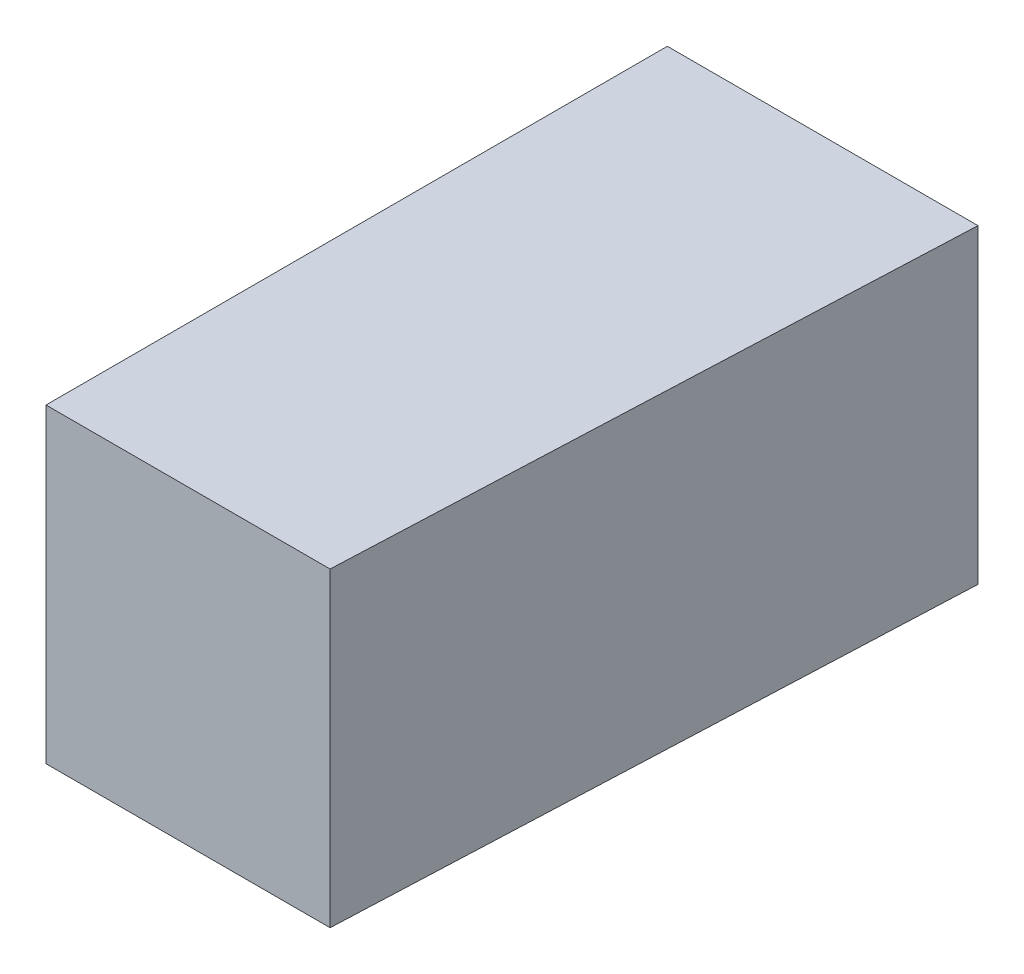
ISO-10303-21;
HEADER;
FILE_DESCRIPTION(('STEP AP214'),'2;1');
FILE_NAME('part.step','',(''),(''),'','','');
FILE_SCHEMA(('AUTOMOTIVE_DESIGN { 1 0 10303 214 1 1 1 1 }'));
ENDSEC;
DATA;
#1=APPLICATION_CONTEXT('core data for automotive mechanical design processes');
#2=APPLICATION_PROTOCOL_DEFINITION('international standard','automotive_design',2000,#1);
#3=PRODUCT_CONTEXT('',#1,'mechanical');
#4=PRODUCT('Part','Part','',(#3));
#5=PRODUCT_RELATED_PRODUCT_CATEGORY('part','',(#4));
#6=PRODUCT_DEFINITION_FORMATION('','',#4);
#7=PRODUCT_DEFINITION_CONTEXT('part definition',#1,'design');
#8=PRODUCT_DEFINITION('design','',#6,#7);
#9=PRODUCT_DEFINITION_SHAPE('','',#8);
#10=(LENGTH_UNIT() NAMED_UNIT(*) SI_UNIT(.MILLI.,.METRE.));
#11=(NAMED_UNIT(*) PLANE_ANGLE_UNIT() SI_UNIT($,.RADIAN.));
#12=(NAMED_UNIT(*) SI_UNIT($,.STERADIAN.) SOLID_ANGLE_UNIT());
#13=UNCERTAINTY_MEASURE_WITH_UNIT(LENGTH_MEASURE(1.E-05),#10,'distance_accuracy_value','');
#14=(GEOMETRIC_REPRESENTATION_CONTEXT(3) GLOBAL_UNCERTAINTY_ASSIGNED_CONTEXT((#13)) GLOBAL_UNIT_ASSIGNED_CONTEXT((#10,
#11,#12)) REPRESENTATION_CONTEXT('',''));
#15=CARTESIAN_POINT('',(0.,0.,0.));
#16=DIRECTION('',(0.,0.,1.));
#17=DIRECTION('',(1.,0.,0.));
#18=AXIS2_PLACEMENT_3D('',#15,#16,#17);
#19=CARTESIAN_POINT('',(0.,10.,0.));
#20=DIRECTION('',(1.,0.,0.));
#21=DIRECTION('',(0.,0.,-1.));
#22=AXIS2_PLACEMENT_3D('',#19,#20,#21);
#23=PLANE('',#22);
#24=DIRECTION('',(0.,0.,-1.));
#25=VECTOR('',#24,1.);
#26=CARTESIAN_POINT('',(0.,8.,-13.385));
#27=LINE('',#26,#25);
#28=CARTESIAN_POINT('',(0.,8.,-6.615));
#29=VERTEX_POINT('',#28);
#30=CARTESIAN_POINT('',(0.,8.,-13.385));
#31=VERTEX_POINT('',#30);
#32=EDGE_CURVE('E235',#29,#31,#27,.T.);
#33=ORIENTED_EDGE('',*,*,#32,.F.);
#34=DIRECTION('',(0.,-1.,0.));
#35=VECTOR('',#34,1.);
#36=CARTESIAN_POINT('',(0.,8.,-6.615));
#37=LINE('',#36,#35);
#38=CARTESIAN_POINT('',(0.,0.,-6.615));
#39=VERTEX_POINT('',#38);
#40=EDGE_CURVE('E179',#29,#39,#37,.T.);
#41=ORIENTED_EDGE('',*,*,#40,.T.);
#42=DIRECTION('',(0.,0.,1.));
#43=VECTOR('',#42,1.);
#44=CARTESIAN_POINT('',(0.,0.,0.));
#45=LINE('',#44,#43);
#46=CARTESIAN_POINT('',(0.,0.,0.));
#47=VERTEX_POINT('',#46);
#48=EDGE_CURVE('E163',#39,#47,#45,.T.);
#49=ORIENTED_EDGE('',*,*,#48,.T.);
#50=DIRECTION('',(0.,-1.,0.));
#51=VECTOR('',#50,1.);
#52=CARTESIAN_POINT('',(0.,10.,0.));
#53=LINE('',#52,#51);
#54=CARTESIAN_POINT('',(0.,10.,0.));
#55=VERTEX_POINT('',#54);
#56=EDGE_CURVE('E11',#55,#47,#53,.T.);
#57=ORIENTED_EDGE('',*,*,#56,.F.);
#58=DIRECTION('',(0.,0.,1.));
#59=VECTOR('',#58,1.);
#60=CARTESIAN_POINT('',(0.,10.,0.));
#61=LINE('',#60,#59);
#62=CARTESIAN_POINT('',(0.,10.,-20.));
#63=VERTEX_POINT('',#62);
#64=EDGE_CURVE('E150',#63,#55,#61,.T.);
#65=ORIENTED_EDGE('',*,*,#64,.F.);
#66=DIRECTION('',(0.,-1.,0.));
#67=VECTOR('',#66,1.);
#68=CARTESIAN_POINT('',(0.,10.,-20.));
#69=LINE('',#68,#67);
#70=CARTESIAN_POINT('',(0.,0.,-20.));
#71=VERTEX_POINT('',#70);
#72=EDGE_CURVE('E154',#63,#71,#69,.T.);
#73=ORIENTED_EDGE('',*,*,#72,.T.);
#74=CARTESIAN_POINT('',(0.,0.,-13.385));
#75=VERTEX_POINT('',#74);
#76=EDGE_CURVE('E160',#71,#75,#45,.T.);
#77=ORIENTED_EDGE('',*,*,#76,.T.);
#78=DIRECTION('',(0.,-1.,0.));
#79=VECTOR('',#78,1.);
#80=CARTESIAN_POINT('',(0.,8.,-13.385));
#81=LINE('',#80,#79);
#82=EDGE_CURVE('E54',#31,#75,#81,.T.);
#83=ORIENTED_EDGE('',*,*,#82,.F.);
#84=EDGE_LOOP('',(#33,#41,#49,#57,#65,#73,#77,#83));
#85=FACE_BOUND('',#84,.T.);
#86=ADVANCED_FACE('F32',(#85),#23,.F.);
#87=CARTESIAN_POINT('',(0.,10.,0.));
#88=DIRECTION('',(0.,0.,-1.));
#89=DIRECTION('',(-1.,0.,0.));
#90=AXIS2_PLACEMENT_3D('',#87,#88,#89);
#91=PLANE('',#90);
#92=DIRECTION('',(1.,0.,0.));
#93=VECTOR('',#92,1.);
#94=CARTESIAN_POINT('',(0.,0.,0.));
#95=LINE('',#94,#93);
#96=CARTESIAN_POINT('',(9.14426704337818,0.,0.));
#97=VERTEX_POINT('',#96);
#98=EDGE_CURVE('E145',#47,#97,#95,.T.);
#99=ORIENTED_EDGE('',*,*,#98,.T.);
#100=DIRECTION('',(0.,-1.,0.));
#101=VECTOR('',#100,1.);
#102=CARTESIAN_POINT('',(9.14426704337818,10.,0.));
#103=LINE('',#102,#101);
#104=CARTESIAN_POINT('',(9.14426704337818,10.,0.));
#105=VERTEX_POINT('',#104);
#106=EDGE_CURVE('E46',#105,#97,#103,.T.);
#107=ORIENTED_EDGE('',*,*,#106,.F.);
#108=DIRECTION('',(1.,0.,0.));
#109=VECTOR('',#108,1.);
#110=CARTESIAN_POINT('',(0.,10.,0.));
#111=LINE('',#110,#109);
#112=EDGE_CURVE('E142',#55,#105,#111,.T.);
#113=ORIENTED_EDGE('',*,*,#112,.F.);
#114=ORIENTED_EDGE('',*,*,#56,.T.);
#115=EDGE_LOOP('',(#99,#107,#113,#114));
#116=FACE_BOUND('',#115,.T.);
#117=ADVANCED_FACE('F141',(#116),#91,.F.);
#118=CARTESIAN_POINT('',(0.,10.,-20.));
#119=DIRECTION('',(0.,0.,1.));
#120=DIRECTION('',(1.,0.,0.));
#121=AXIS2_PLACEMENT_3D('',#118,#119,#120);
#122=PLANE('',#121);
#123=DIRECTION('',(-1.,0.,0.));
#124=VECTOR('',#123,1.);
#125=CARTESIAN_POINT('',(0.,0.,-20.));
#126=LINE('',#125,#124);
#127=CARTESIAN_POINT('',(10.,0.,-20.));
#128=VERTEX_POINT('',#127);
#129=EDGE_CURVE('E156',#128,#71,#126,.T.);
#130=ORIENTED_EDGE('',*,*,#129,.T.);
#131=ORIENTED_EDGE('',*,*,#72,.F.);
#132=DIRECTION('',(-1.,0.,0.));
#133=VECTOR('',#132,1.);
#134=CARTESIAN_POINT('',(0.,10.,-20.));
#135=LINE('',#134,#133);
#136=CARTESIAN_POINT('',(10.,10.,-20.));
#137=VERTEX_POINT('',#136);
#138=EDGE_CURVE('E152',#137,#63,#135,.T.);
#139=ORIENTED_EDGE('',*,*,#138,.F.);
#140=DIRECTION('',(0.,-1.,0.));
#141=VECTOR('',#140,1.);
#142=CARTESIAN_POINT('',(10.,10.,-20.));
#143=LINE('',#142,#141);
#144=EDGE_CURVE('E39',#137,#128,#143,.T.);
#145=ORIENTED_EDGE('',*,*,#144,.T.);
#146=EDGE_LOOP('',(#130,#131,#139,#145));
#147=FACE_BOUND('',#146,.T.);
#148=ADVANCED_FACE('F169',(#147),#122,.F.);
#149=CARTESIAN_POINT('',(0.,10.,0.));
#150=DIRECTION('',(0.,-1.,0.));
#151=DIRECTION('',(0.,0.,-1.));
#152=AXIS2_PLACEMENT_3D('',#149,#150,#151);
#153=PLANE('',#152);
#154=ORIENTED_EDGE('',*,*,#112,.T.);
#155=DIRECTION('',(0.0427475368243261,0.,-0.999085906264047));
#156=VECTOR('',#155,1.);
#157=CARTESIAN_POINT('',(9.14426704337818,10.,0.));
#158=LINE('',#157,#156);
#159=EDGE_CURVE('E131',#105,#137,#158,.T.);
#160=ORIENTED_EDGE('',*,*,#159,.T.);
#161=ORIENTED_EDGE('',*,*,#138,.T.);
#162=ORIENTED_EDGE('',*,*,#64,.T.);
#163=EDGE_LOOP('',(#154,#160,#161,#162));
#164=FACE_BOUND('',#163,.T.);
#165=ADVANCED_FACE('F148',(#164),#153,.F.);
#166=CARTESIAN_POINT('',(0.,0.,0.));
#167=DIRECTION('',(0.,-1.,0.));
#168=DIRECTION('',(0.,0.,-1.));
#169=AXIS2_PLACEMENT_3D('',#166,#167,#168);
#170=PLANE('',#169);
#171=DIRECTION('',(0.0427475368243261,0.,-0.999085906264047));
#172=VECTOR('',#171,1.);
#173=CARTESIAN_POINT('',(9.14426704337818,0.,0.));
#174=LINE('',#173,#172);
#175=EDGE_CURVE('E137',#97,#128,#174,.T.);
#176=ORIENTED_EDGE('',*,*,#175,.F.);
#177=ORIENTED_EDGE('',*,*,#98,.F.);
#178=ORIENTED_EDGE('',*,*,#48,.F.);
#179=DIRECTION('',(-1.,0.,0.));
#180=VECTOR('',#179,1.);
#181=CARTESIAN_POINT('',(0.,0.,-6.615));
#182=LINE('',#181,#180);
#183=CARTESIAN_POINT('',(1.8,0.,-6.615));
#184=VERTEX_POINT('',#183);
#185=EDGE_CURVE('E186',#184,#39,#182,.T.);
#186=ORIENTED_EDGE('',*,*,#185,.F.);
#187=DIRECTION('',(0.,0.,-1.));
#188=VECTOR('',#187,1.);
#189=CARTESIAN_POINT('',(1.8,0.,-6.615));
#190=LINE('',#189,#188);
#191=CARTESIAN_POINT('',(1.8,0.,-4.5));
#192=VERTEX_POINT('',#191);
#193=EDGE_CURVE('E231',#192,#184,#190,.T.);
#194=ORIENTED_EDGE('',*,*,#193,.F.);
#195=DIRECTION('',(-1.,0.,0.));
#196=VECTOR('',#195,1.);
#197=CARTESIAN_POINT('',(1.8,0.,-4.5));
#198=LINE('',#197,#196);
#199=CARTESIAN_POINT('',(3.44,0.,-4.5));
#200=VERTEX_POINT('',#199);
#201=EDGE_CURVE('E229',#200,#192,#198,.T.);
#202=ORIENTED_EDGE('',*,*,#201,.F.);
#203=DIRECTION('',(-0.707106781186547,0.,0.707106781186548));
#204=VECTOR('',#203,1.);
#205=CARTESIAN_POINT('',(3.44,0.,-4.5));
#206=LINE('',#205,#204);
#207=CARTESIAN_POINT('',(6.1,0.,-7.16));
#208=VERTEX_POINT('',#207);
#209=EDGE_CURVE('E226',#208,#200,#206,.T.);
#210=ORIENTED_EDGE('',*,*,#209,.F.);
#211=DIRECTION('',(0.,0.,1.));
#212=VECTOR('',#211,1.);
#213=CARTESIAN_POINT('',(6.1,0.,-7.16));
#214=LINE('',#213,#212);
#215=CARTESIAN_POINT('',(6.1,0.,-12.84));
#216=VERTEX_POINT('',#215);
#217=EDGE_CURVE('E223',#216,#208,#214,.T.);
#218=ORIENTED_EDGE('',*,*,#217,.F.);
#219=DIRECTION('',(0.707106781186547,0.,0.707106781186548));
#220=VECTOR('',#219,1.);
#221=CARTESIAN_POINT('',(6.1,0.,-12.84));
#222=LINE('',#221,#220);
#223=CARTESIAN_POINT('',(3.44,0.,-15.5));
#224=VERTEX_POINT('',#223);
#225=EDGE_CURVE('E220',#224,#216,#222,.T.);
#226=ORIENTED_EDGE('',*,*,#225,.F.);
#227=DIRECTION('',(1.,0.,0.));
#228=VECTOR('',#227,1.);
#229=CARTESIAN_POINT('',(3.44,0.,-15.5));
#230=LINE('',#229,#228);
#231=CARTESIAN_POINT('',(1.8,0.,-15.5));
#232=VERTEX_POINT('',#231);
#233=EDGE_CURVE('E217',#232,#224,#230,.T.);
#234=ORIENTED_EDGE('',*,*,#233,.F.);
#235=DIRECTION('',(0.,0.,-1.));
#236=VECTOR('',#235,1.);
#237=CARTESIAN_POINT('',(1.8,0.,-15.5));
#238=LINE('',#237,#236);
#239=CARTESIAN_POINT('',(1.8,0.,-13.385));
#240=VERTEX_POINT('',#239);
#241=EDGE_CURVE('E214',#240,#232,#238,.T.);
#242=ORIENTED_EDGE('',*,*,#241,.F.);
#243=DIRECTION('',(1.,0.,0.));
#244=VECTOR('',#243,1.);
#245=CARTESIAN_POINT('',(1.8,0.,-13.385));
#246=LINE('',#245,#244);
#247=EDGE_CURVE('E146',#75,#240,#246,.T.);
#248=ORIENTED_EDGE('',*,*,#247,.F.);
#249=ORIENTED_EDGE('',*,*,#76,.F.);
#250=ORIENTED_EDGE('',*,*,#129,.F.);
#251=EDGE_LOOP('',(#176,#177,#178,#186,#194,#202,#210,#218,#226,#234,#242,#248,#249,#250));
#252=FACE_BOUND('',#251,.T.);
#253=ADVANCED_FACE('F173',(#252),#170,.T.);
#254=CARTESIAN_POINT('',(0.,8.,-6.615));
#255=DIRECTION('',(0.,0.,1.));
#256=DIRECTION('',(1.,0.,0.));
#257=AXIS2_PLACEMENT_3D('',#254,#255,#256);
#258=PLANE('',#257);
#259=ORIENTED_EDGE('',*,*,#185,.T.);
#260=ORIENTED_EDGE('',*,*,#40,.F.);
#261=DIRECTION('',(-1.,0.,0.));
#262=VECTOR('',#261,1.);
#263=CARTESIAN_POINT('',(0.,8.,-6.615));
#264=LINE('',#263,#262);
#265=CARTESIAN_POINT('',(1.8,8.,-6.615));
#266=VERTEX_POINT('',#265);
#267=EDGE_CURVE('E201',#266,#29,#264,.T.);
#268=ORIENTED_EDGE('',*,*,#267,.F.);
#269=DIRECTION('',(0.,-1.,0.));
#270=VECTOR('',#269,1.);
#271=CARTESIAN_POINT('',(1.8,8.,-6.615));
#272=LINE('',#271,#270);
#273=EDGE_CURVE('E181',#266,#184,#272,.T.);
#274=ORIENTED_EDGE('',*,*,#273,.T.);
#275=EDGE_LOOP('',(#259,#260,#268,#274));
#276=FACE_BOUND('',#275,.T.);
#277=ADVANCED_FACE('F266',(#276),#258,.F.);
#278=CARTESIAN_POINT('',(1.8,8.,-6.615));
#279=DIRECTION('',(-1.,0.,0.));
#280=DIRECTION('',(0.,0.,1.));
#281=AXIS2_PLACEMENT_3D('',#278,#279,#280);
#282=PLANE('',#281);
#283=ORIENTED_EDGE('',*,*,#193,.T.);
#284=ORIENTED_EDGE('',*,*,#273,.F.);
#285=DIRECTION('',(0.,0.,-1.));
#286=VECTOR('',#285,1.);
#287=CARTESIAN_POINT('',(1.8,8.,-6.615));
#288=LINE('',#287,#286);
#289=CARTESIAN_POINT('',(1.8,8.,-4.5));
#290=VERTEX_POINT('',#289);
#291=EDGE_CURVE('E203',#290,#266,#288,.T.);
#292=ORIENTED_EDGE('',*,*,#291,.F.);
#293=DIRECTION('',(0.,-1.,0.));
#294=VECTOR('',#293,1.);
#295=CARTESIAN_POINT('',(1.8,8.,-4.5));
#296=LINE('',#295,#294);
#297=EDGE_CURVE('E183',#290,#192,#296,.T.);
#298=ORIENTED_EDGE('',*,*,#297,.T.);
#299=EDGE_LOOP('',(#283,#284,#292,#298));
#300=FACE_BOUND('',#299,.T.);
#301=ADVANCED_FACE('F265',(#300),#282,.F.);
#302=CARTESIAN_POINT('',(1.8,8.,-4.5));
#303=DIRECTION('',(0.,0.,1.));
#304=DIRECTION('',(1.,0.,0.));
#305=AXIS2_PLACEMENT_3D('',#302,#303,#304);
#306=PLANE('',#305);
#307=ORIENTED_EDGE('',*,*,#201,.T.);
#308=ORIENTED_EDGE('',*,*,#297,.F.);
#309=DIRECTION('',(-1.,0.,0.));
#310=VECTOR('',#309,1.);
#311=CARTESIAN_POINT('',(1.8,8.,-4.5));
#312=LINE('',#311,#310);
#313=CARTESIAN_POINT('',(3.44,8.,-4.5));
#314=VERTEX_POINT('',#313);
#315=EDGE_CURVE('E209',#314,#290,#312,.T.);
#316=ORIENTED_EDGE('',*,*,#315,.F.);
#317=DIRECTION('',(0.,-1.,0.));
#318=VECTOR('',#317,1.);
#319=CARTESIAN_POINT('',(3.44,8.,-4.5));
#320=LINE('',#319,#318);
#321=EDGE_CURVE('E190',#314,#200,#320,.T.);
#322=ORIENTED_EDGE('',*,*,#321,.T.);
#323=EDGE_LOOP('',(#307,#308,#316,#322));
#324=FACE_BOUND('',#323,.T.);
#325=ADVANCED_FACE('F263',(#324),#306,.F.);
#326=CARTESIAN_POINT('',(3.44,8.,-4.5));
#327=DIRECTION('',(0.707106781186548,0.,0.707106781186547));
#328=DIRECTION('',(0.707106781186547,0.,-0.707106781186548));
#329=AXIS2_PLACEMENT_3D('',#326,#327,#328);
#330=PLANE('',#329);
#331=ORIENTED_EDGE('',*,*,#209,.T.);
#332=ORIENTED_EDGE('',*,*,#321,.F.);
#333=DIRECTION('',(-0.707106781186547,0.,0.707106781186548));
#334=VECTOR('',#333,1.);
#335=CARTESIAN_POINT('',(3.44,8.,-4.5));
#336=LINE('',#335,#334);
#337=CARTESIAN_POINT('',(6.1,8.,-7.16));
#338=VERTEX_POINT('',#337);
#339=EDGE_CURVE('E255',#338,#314,#336,.T.);
#340=ORIENTED_EDGE('',*,*,#339,.F.);
#341=DIRECTION('',(0.,-1.,0.));
#342=VECTOR('',#341,1.);
#343=CARTESIAN_POINT('',(6.1,8.,-7.16));
#344=LINE('',#343,#342);
#345=EDGE_CURVE('E192',#338,#208,#344,.T.);
#346=ORIENTED_EDGE('',*,*,#345,.T.);
#347=EDGE_LOOP('',(#331,#332,#340,#346));
#348=FACE_BOUND('',#347,.T.);
#349=ADVANCED_FACE('F305',(#348),#330,.F.);
#350=CARTESIAN_POINT('',(6.1,8.,-7.16));
#351=DIRECTION('',(1.,0.,0.));
#352=DIRECTION('',(0.,0.,-1.));
#353=AXIS2_PLACEMENT_3D('',#350,#351,#352);
#354=PLANE('',#353);
#355=ORIENTED_EDGE('',*,*,#217,.T.);
#356=ORIENTED_EDGE('',*,*,#345,.F.);
#357=DIRECTION('',(0.,0.,1.));
#358=VECTOR('',#357,1.);
#359=CARTESIAN_POINT('',(6.1,8.,-7.16));
#360=LINE('',#359,#358);
#361=CARTESIAN_POINT('',(6.1,8.,-12.84));
#362=VERTEX_POINT('',#361);
#363=EDGE_CURVE('E252',#362,#338,#360,.T.);
#364=ORIENTED_EDGE('',*,*,#363,.F.);
#365=DIRECTION('',(0.,-1.,0.));
#366=VECTOR('',#365,1.);
#367=CARTESIAN_POINT('',(6.1,8.,-12.84));
#368=LINE('',#367,#366);
#369=EDGE_CURVE('E194',#362,#216,#368,.T.);
#370=ORIENTED_EDGE('',*,*,#369,.T.);
#371=EDGE_LOOP('',(#355,#356,#364,#370));
#372=FACE_BOUND('',#371,.T.);
#373=ADVANCED_FACE('F301',(#372),#354,.F.);
#374=CARTESIAN_POINT('',(6.1,8.,-12.84));
#375=DIRECTION('',(0.707106781186548,0.,-0.707106781186547));
#376=DIRECTION('',(-0.707106781186547,0.,-0.707106781186548));
#377=AXIS2_PLACEMENT_3D('',#374,#375,#376);
#378=PLANE('',#377);
#379=ORIENTED_EDGE('',*,*,#225,.T.);
#380=ORIENTED_EDGE('',*,*,#369,.F.);
#381=DIRECTION('',(0.707106781186547,0.,0.707106781186548));
#382=VECTOR('',#381,1.);
#383=CARTESIAN_POINT('',(6.1,8.,-12.84));
#384=LINE('',#383,#382);
#385=CARTESIAN_POINT('',(3.44,8.,-15.5));
#386=VERTEX_POINT('',#385);
#387=EDGE_CURVE('E249',#386,#362,#384,.T.);
#388=ORIENTED_EDGE('',*,*,#387,.F.);
#389=DIRECTION('',(0.,-1.,0.));
#390=VECTOR('',#389,1.);
#391=CARTESIAN_POINT('',(3.44,8.,-15.5));
#392=LINE('',#391,#390);
#393=EDGE_CURVE('E196',#386,#224,#392,.T.);
#394=ORIENTED_EDGE('',*,*,#393,.T.);
#395=EDGE_LOOP('',(#379,#380,#388,#394));
#396=FACE_BOUND('',#395,.T.);
#397=ADVANCED_FACE('F297',(#396),#378,.F.);
#398=CARTESIAN_POINT('',(3.44,8.,-15.5));
#399=DIRECTION('',(0.,0.,-1.));
#400=DIRECTION('',(-1.,0.,0.));
#401=AXIS2_PLACEMENT_3D('',#398,#399,#400);
#402=PLANE('',#401);
#403=ORIENTED_EDGE('',*,*,#233,.T.);
#404=ORIENTED_EDGE('',*,*,#393,.F.);
#405=DIRECTION('',(1.,0.,0.));
#406=VECTOR('',#405,1.);
#407=CARTESIAN_POINT('',(3.44,8.,-15.5));
#408=LINE('',#407,#406);
#409=CARTESIAN_POINT('',(1.8,8.,-15.5));
#410=VERTEX_POINT('',#409);
#411=EDGE_CURVE('E246',#410,#386,#408,.T.);
#412=ORIENTED_EDGE('',*,*,#411,.F.);
#413=DIRECTION('',(0.,-1.,0.));
#414=VECTOR('',#413,1.);
#415=CARTESIAN_POINT('',(1.8,8.,-15.5));
#416=LINE('',#415,#414);
#417=EDGE_CURVE('E198',#410,#232,#416,.T.);
#418=ORIENTED_EDGE('',*,*,#417,.T.);
#419=EDGE_LOOP('',(#403,#404,#412,#418));
#420=FACE_BOUND('',#419,.T.);
#421=ADVANCED_FACE('F293',(#420),#402,.F.);
#422=CARTESIAN_POINT('',(1.8,8.,-15.5));
#423=DIRECTION('',(-1.,0.,0.));
#424=DIRECTION('',(0.,0.,1.));
#425=AXIS2_PLACEMENT_3D('',#422,#423,#424);
#426=PLANE('',#425);
#427=ORIENTED_EDGE('',*,*,#241,.T.);
#428=ORIENTED_EDGE('',*,*,#417,.F.);
#429=DIRECTION('',(0.,0.,-1.));
#430=VECTOR('',#429,1.);
#431=CARTESIAN_POINT('',(1.8,8.,-15.5));
#432=LINE('',#431,#430);
#433=CARTESIAN_POINT('',(1.8,8.,-13.385));
#434=VERTEX_POINT('',#433);
#435=EDGE_CURVE('E240',#434,#410,#432,.T.);
#436=ORIENTED_EDGE('',*,*,#435,.F.);
#437=DIRECTION('',(0.,-1.,0.));
#438=VECTOR('',#437,1.);
#439=CARTESIAN_POINT('',(1.8,8.,-13.385));
#440=LINE('',#439,#438);
#441=EDGE_CURVE('E200',#434,#240,#440,.T.);
#442=ORIENTED_EDGE('',*,*,#441,.T.);
#443=EDGE_LOOP('',(#427,#428,#436,#442));
#444=FACE_BOUND('',#443,.T.);
#445=ADVANCED_FACE('F290',(#444),#426,.F.);
#446=CARTESIAN_POINT('',(1.8,8.,-13.385));
#447=DIRECTION('',(0.,0.,-1.));
#448=DIRECTION('',(-1.,0.,0.));
#449=AXIS2_PLACEMENT_3D('',#446,#447,#448);
#450=PLANE('',#449);
#451=ORIENTED_EDGE('',*,*,#247,.T.);
#452=ORIENTED_EDGE('',*,*,#441,.F.);
#453=DIRECTION('',(1.,0.,0.));
#454=VECTOR('',#453,1.);
#455=CARTESIAN_POINT('',(1.8,8.,-13.385));
#456=LINE('',#455,#454);
#457=EDGE_CURVE('E237',#31,#434,#456,.T.);
#458=ORIENTED_EDGE('',*,*,#457,.F.);
#459=ORIENTED_EDGE('',*,*,#82,.T.);
#460=EDGE_LOOP('',(#451,#452,#458,#459));
#461=FACE_BOUND('',#460,.T.);
#462=ADVANCED_FACE('F287',(#461),#450,.F.);
#463=CARTESIAN_POINT('',(0.,8.,0.));
#464=DIRECTION('',(0.,1.,0.));
#465=DIRECTION('',(0.,0.,1.));
#466=AXIS2_PLACEMENT_3D('',#463,#464,#465);
#467=PLANE('',#466);
#468=ORIENTED_EDGE('',*,*,#32,.T.);
#469=ORIENTED_EDGE('',*,*,#457,.T.);
#470=ORIENTED_EDGE('',*,*,#435,.T.);
#471=ORIENTED_EDGE('',*,*,#411,.T.);
#472=ORIENTED_EDGE('',*,*,#387,.T.);
#473=ORIENTED_EDGE('',*,*,#363,.T.);
#474=ORIENTED_EDGE('',*,*,#339,.T.);
#475=ORIENTED_EDGE('',*,*,#315,.T.);
#476=ORIENTED_EDGE('',*,*,#291,.T.);
#477=ORIENTED_EDGE('',*,*,#267,.T.);
#478=EDGE_LOOP('',(#468,#469,#470,#471,#472,#473,#474,#475,#476,#477));
#479=FACE_BOUND('',#478,.T.);
#480=ADVANCED_FACE('F259',(#479),#467,.F.);
#481=CARTESIAN_POINT('',(9.14426704337818,10.,0.));
#482=DIRECTION('',(-0.999085906264047,0.,-0.0427475368243261));
#483=DIRECTION('',(-0.0427475368243261,0.,0.999085906264047));
#484=AXIS2_PLACEMENT_3D('',#481,#482,#483);
#485=PLANE('',#484);
#486=ORIENTED_EDGE('',*,*,#175,.T.);
#487=ORIENTED_EDGE('',*,*,#144,.F.);
#488=ORIENTED_EDGE('',*,*,#159,.F.);
#489=ORIENTED_EDGE('',*,*,#106,.T.);
#490=EDGE_LOOP('',(#486,#487,#488,#489));
#491=FACE_BOUND('',#490,.T.);
#492=ADVANCED_FACE('F132',(#491),#485,.F.);
#493=CLOSED_SHELL('',(#86,#117,#148,#165,#253,#277,#301,#325,#349,#373,#397,#421,#445,#462,#480,#492));
#494=MANIFOLD_SOLID_BREP('B2',#493);
#495=ADVANCED_BREP_SHAPE_REPRESENTATION('',(#18,#494),#14);
#496=SHAPE_DEFINITION_REPRESENTATION(#9,#495);
ENDSEC;
END-ISO-10303-21;
